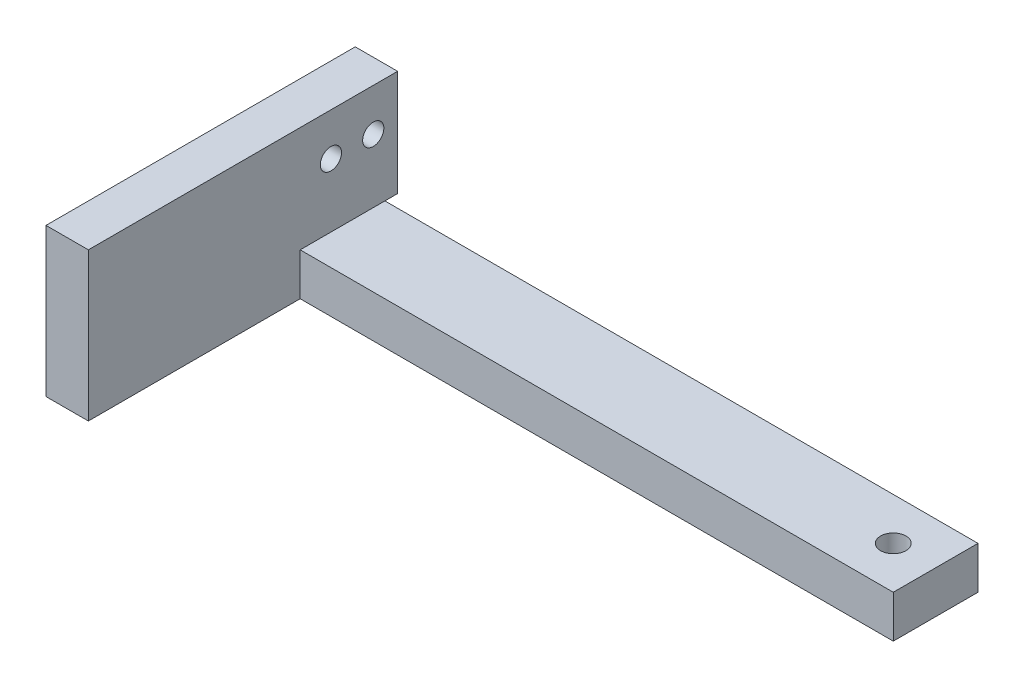
ISO-10303-21;
HEADER;
FILE_DESCRIPTION(('STEP AP214'),'2;1');
FILE_NAME('part.step','',(''),(''),'','','');
FILE_SCHEMA(('AUTOMOTIVE_DESIGN { 1 0 10303 214 1 1 1 1 }'));
ENDSEC;
DATA;
#1=APPLICATION_CONTEXT('core data for automotive mechanical design processes');
#2=APPLICATION_PROTOCOL_DEFINITION('international standard','automotive_design',2000,#1);
#3=PRODUCT_CONTEXT('',#1,'mechanical');
#4=PRODUCT('Part','Part','',(#3));
#5=PRODUCT_RELATED_PRODUCT_CATEGORY('part','',(#4));
#6=PRODUCT_DEFINITION_FORMATION('','',#4);
#7=PRODUCT_DEFINITION_CONTEXT('part definition',#1,'design');
#8=PRODUCT_DEFINITION('design','',#6,#7);
#9=PRODUCT_DEFINITION_SHAPE('','',#8);
#10=(LENGTH_UNIT() NAMED_UNIT(*) SI_UNIT(.MILLI.,.METRE.));
#11=(NAMED_UNIT(*) PLANE_ANGLE_UNIT() SI_UNIT($,.RADIAN.));
#12=(NAMED_UNIT(*) SI_UNIT($,.STERADIAN.) SOLID_ANGLE_UNIT());
#13=UNCERTAINTY_MEASURE_WITH_UNIT(LENGTH_MEASURE(1.E-05),#10,'distance_accuracy_value','');
#14=(GEOMETRIC_REPRESENTATION_CONTEXT(3) GLOBAL_UNCERTAINTY_ASSIGNED_CONTEXT((#13)) GLOBAL_UNIT_ASSIGNED_CONTEXT((#10,
#11,#12)) REPRESENTATION_CONTEXT('',''));
#15=CARTESIAN_POINT('',(0.,0.,0.));
#16=DIRECTION('',(0.,0.,1.));
#17=DIRECTION('',(1.,0.,0.));
#18=AXIS2_PLACEMENT_3D('',#15,#16,#17);
#19=CARTESIAN_POINT('',(-2547.77070063694,10.,-431.167728237792));
#20=DIRECTION('',(0.,0.,-1.));
#21=DIRECTION('',(-1.,0.,0.));
#22=AXIS2_PLACEMENT_3D('',#19,#20,#21);
#23=PLANE('',#22);
#24=DIRECTION('',(0.,1.,0.));
#25=VECTOR('',#24,1.);
#26=CARTESIAN_POINT('',(-2537.77070063694,35.,-431.167728237793));
#27=LINE('',#26,#25);
#28=CARTESIAN_POINT('',(-2537.77070063694,0.,-431.167728237792));
#29=VERTEX_POINT('',#28);
#30=CARTESIAN_POINT('',(-2537.77070063694,10.,-431.167728237792));
#31=VERTEX_POINT('',#30);
#32=EDGE_CURVE('E50',#29,#31,#27,.T.);
#33=ORIENTED_EDGE('',*,*,#32,.F.);
#34=DIRECTION('',(1.,0.,0.));
#35=VECTOR('',#34,1.);
#36=CARTESIAN_POINT('',(-2547.77070063694,0.,-431.167728237792));
#37=LINE('',#36,#35);
#38=CARTESIAN_POINT('',(-2397.77070063694,0.,-431.167728237792));
#39=VERTEX_POINT('',#38);
#40=EDGE_CURVE('E171',#29,#39,#37,.T.);
#41=ORIENTED_EDGE('',*,*,#40,.T.);
#42=DIRECTION('',(0.,-1.,0.));
#43=VECTOR('',#42,1.);
#44=CARTESIAN_POINT('',(-2397.77070063694,10.,-431.167728237792));
#45=LINE('',#44,#43);
#46=CARTESIAN_POINT('',(-2397.77070063694,10.,-431.167728237792));
#47=VERTEX_POINT('',#46);
#48=EDGE_CURVE('E41',#47,#39,#45,.T.);
#49=ORIENTED_EDGE('',*,*,#48,.F.);
#50=DIRECTION('',(1.,0.,0.));
#51=VECTOR('',#50,1.);
#52=CARTESIAN_POINT('',(-2547.77070063694,10.,-431.167728237792));
#53=LINE('',#52,#51);
#54=EDGE_CURVE('E161',#31,#47,#53,.T.);
#55=ORIENTED_EDGE('',*,*,#54,.F.);
#56=EDGE_LOOP('',(#33,#41,#49,#55));
#57=FACE_BOUND('',#56,.T.);
#58=ADVANCED_FACE('F32',(#57),#23,.F.);
#59=CARTESIAN_POINT('',(0.,10.,0.));
#60=DIRECTION('',(0.,1.,0.));
#61=DIRECTION('',(0.,0.,1.));
#62=AXIS2_PLACEMENT_3D('',#59,#60,#61);
#63=PLANE('',#62);
#64=CARTESIAN_POINT('',(-2407.77070063694,10.,-441.167728237792));
#65=DIRECTION('',(0.,1.,0.));
#66=DIRECTION('',(0.,0.,1.));
#67=AXIS2_PLACEMENT_3D('',#64,#65,#66);
#68=CIRCLE('',#67,3.00000000000017);
#69=CARTESIAN_POINT('',(-2407.77070063694,10.,-438.167728237792));
#70=VERTEX_POINT('',#69);
#71=EDGE_CURVE('E153',#70,#70,#68,.T.);
#72=ORIENTED_EDGE('',*,*,#71,.F.);
#73=EDGE_LOOP('',(#72));
#74=FACE_BOUND('',#73,.T.);
#75=DIRECTION('',(-1.,0.,0.));
#76=VECTOR('',#75,1.);
#77=CARTESIAN_POINT('',(-2547.77070063694,10.,-451.167728237792));
#78=LINE('',#77,#76);
#79=CARTESIAN_POINT('',(-2397.77070063694,10.,-451.167728237792));
#80=VERTEX_POINT('',#79);
#81=CARTESIAN_POINT('',(-2537.77070063694,10.,-451.167728237792));
#82=VERTEX_POINT('',#81);
#83=EDGE_CURVE('E167',#80,#82,#78,.T.);
#84=ORIENTED_EDGE('',*,*,#83,.T.);
#85=DIRECTION('',(0.,0.,1.));
#86=VECTOR('',#85,1.);
#87=CARTESIAN_POINT('',(-2537.77070063694,10.,-454.167728237792));
#88=LINE('',#87,#86);
#89=EDGE_CURVE('E11',#82,#31,#88,.T.);
#90=ORIENTED_EDGE('',*,*,#89,.T.);
#91=ORIENTED_EDGE('',*,*,#54,.T.);
#92=DIRECTION('',(0.,0.,-1.));
#93=VECTOR('',#92,1.);
#94=CARTESIAN_POINT('',(-2397.77070063694,10.,-451.167728237792));
#95=LINE('',#94,#93);
#96=EDGE_CURVE('E163',#47,#80,#95,.T.);
#97=ORIENTED_EDGE('',*,*,#96,.T.);
#98=EDGE_LOOP('',(#84,#90,#91,#97));
#99=FACE_BOUND('',#98,.T.);
#100=ADVANCED_FACE('F202',(#74,#99),#63,.T.);
#101=CARTESIAN_POINT('',(-2547.77070063694,10.,-451.167728237792));
#102=DIRECTION('',(1.,0.,0.));
#103=DIRECTION('',(0.,0.,-1.));
#104=AXIS2_PLACEMENT_3D('',#101,#102,#103);
#105=PLANE('',#104);
#106=CARTESIAN_POINT('',(-2547.77070063694,25.,-448.417728237792));
#107=DIRECTION('',(-1.,0.,0.));
#108=DIRECTION('',(0.,0.,1.));
#109=AXIS2_PLACEMENT_3D('',#106,#107,#108);
#110=CIRCLE('',#109,2.50000000000002);
#111=CARTESIAN_POINT('',(-2547.77070063694,25.,-445.917728237792));
#112=VERTEX_POINT('',#111);
#113=EDGE_CURVE('E136',#112,#112,#110,.T.);
#114=ORIENTED_EDGE('',*,*,#113,.F.);
#115=EDGE_LOOP('',(#114));
#116=FACE_BOUND('',#115,.T.);
#117=CARTESIAN_POINT('',(-2547.77070063694,25.,-438.417728237792));
#118=DIRECTION('',(-1.,0.,0.));
#119=DIRECTION('',(0.,0.,1.));
#120=AXIS2_PLACEMENT_3D('',#117,#118,#119);
#121=CIRCLE('',#120,2.50000000000002);
#122=CARTESIAN_POINT('',(-2547.77070063694,25.,-435.917728237792));
#123=VERTEX_POINT('',#122);
#124=EDGE_CURVE('E135',#123,#123,#121,.T.);
#125=ORIENTED_EDGE('',*,*,#124,.F.);
#126=EDGE_LOOP('',(#125));
#127=FACE_BOUND('',#126,.T.);
#128=DIRECTION('',(0.,0.,1.));
#129=VECTOR('',#128,1.);
#130=CARTESIAN_POINT('',(-2547.77070063694,0.,-451.167728237792));
#131=LINE('',#130,#129);
#132=CARTESIAN_POINT('',(-2547.77070063694,0.,-451.167728237792));
#133=VERTEX_POINT('',#132);
#134=CARTESIAN_POINT('',(-2547.77070063694,0.,-381.167728237793));
#135=VERTEX_POINT('',#134);
#136=EDGE_CURVE('E158',#133,#135,#131,.T.);
#137=ORIENTED_EDGE('',*,*,#136,.T.);
#138=DIRECTION('',(0.,-1.,0.));
#139=VECTOR('',#138,1.);
#140=CARTESIAN_POINT('',(-2547.77070063694,35.,-381.167728237793));
#141=LINE('',#140,#139);
#142=CARTESIAN_POINT('',(-2547.77070063694,35.,-381.167728237793));
#143=VERTEX_POINT('',#142);
#144=EDGE_CURVE('E122',#143,#135,#141,.T.);
#145=ORIENTED_EDGE('',*,*,#144,.F.);
#146=DIRECTION('',(0.,0.,-1.));
#147=VECTOR('',#146,1.);
#148=CARTESIAN_POINT('',(-2547.77070063694,35.,-454.167728237792));
#149=LINE('',#148,#147);
#150=CARTESIAN_POINT('',(-2547.77070063694,35.,-454.167728237792));
#151=VERTEX_POINT('',#150);
#152=EDGE_CURVE('E118',#143,#151,#149,.T.);
#153=ORIENTED_EDGE('',*,*,#152,.T.);
#154=DIRECTION('',(0.,-1.,0.));
#155=VECTOR('',#154,1.);
#156=CARTESIAN_POINT('',(-2547.77070063694,35.,-454.167728237792));
#157=LINE('',#156,#155);
#158=CARTESIAN_POINT('',(-2547.77070063694,10.,-454.167728237792));
#159=VERTEX_POINT('',#158);
#160=EDGE_CURVE('E146',#151,#159,#157,.T.);
#161=ORIENTED_EDGE('',*,*,#160,.T.);
#162=DIRECTION('',(0.,0.,1.));
#163=VECTOR('',#162,1.);
#164=CARTESIAN_POINT('',(-2547.77070063694,10.,-454.167728237792));
#165=LINE('',#164,#163);
#166=CARTESIAN_POINT('',(-2547.77070063694,10.,-451.167728237792));
#167=VERTEX_POINT('',#166);
#168=EDGE_CURVE('E112',#159,#167,#165,.T.);
#169=ORIENTED_EDGE('',*,*,#168,.T.);
#170=DIRECTION('',(0.,-1.,0.));
#171=VECTOR('',#170,1.);
#172=CARTESIAN_POINT('',(-2547.77070063694,10.,-451.167728237792));
#173=LINE('',#172,#171);
#174=EDGE_CURVE('E169',#167,#133,#173,.T.);
#175=ORIENTED_EDGE('',*,*,#174,.T.);
#176=EDGE_LOOP('',(#137,#145,#153,#161,#169,#175));
#177=FACE_BOUND('',#176,.T.);
#178=ADVANCED_FACE('F34',(#116,#127,#177),#105,.F.);
#179=CARTESIAN_POINT('',(-2397.77070063694,10.,-451.167728237792));
#180=DIRECTION('',(-1.,0.,0.));
#181=DIRECTION('',(0.,0.,1.));
#182=AXIS2_PLACEMENT_3D('',#179,#180,#181);
#183=PLANE('',#182);
#184=DIRECTION('',(0.,0.,-1.));
#185=VECTOR('',#184,1.);
#186=CARTESIAN_POINT('',(-2397.77070063694,0.,-451.167728237792));
#187=LINE('',#186,#185);
#188=CARTESIAN_POINT('',(-2397.77070063694,0.,-451.167728237792));
#189=VERTEX_POINT('',#188);
#190=EDGE_CURVE('E173',#39,#189,#187,.T.);
#191=ORIENTED_EDGE('',*,*,#190,.T.);
#192=DIRECTION('',(0.,-1.,0.));
#193=VECTOR('',#192,1.);
#194=CARTESIAN_POINT('',(-2397.77070063694,10.,-451.167728237792));
#195=LINE('',#194,#193);
#196=EDGE_CURVE('E178',#80,#189,#195,.T.);
#197=ORIENTED_EDGE('',*,*,#196,.F.);
#198=ORIENTED_EDGE('',*,*,#96,.F.);
#199=ORIENTED_EDGE('',*,*,#48,.T.);
#200=EDGE_LOOP('',(#191,#197,#198,#199));
#201=FACE_BOUND('',#200,.T.);
#202=ADVANCED_FACE('F209',(#201),#183,.F.);
#203=CARTESIAN_POINT('',(-2547.77070063694,10.,-451.167728237792));
#204=DIRECTION('',(0.,0.,1.));
#205=DIRECTION('',(1.,0.,0.));
#206=AXIS2_PLACEMENT_3D('',#203,#204,#205);
#207=PLANE('',#206);
#208=DIRECTION('',(-1.,0.,0.));
#209=VECTOR('',#208,1.);
#210=CARTESIAN_POINT('',(-2547.77070063694,0.,-451.167728237792));
#211=LINE('',#210,#209);
#212=EDGE_CURVE('E164',#189,#133,#211,.T.);
#213=ORIENTED_EDGE('',*,*,#212,.T.);
#214=ORIENTED_EDGE('',*,*,#174,.F.);
#215=EDGE_CURVE('E166',#82,#167,#78,.T.);
#216=ORIENTED_EDGE('',*,*,#215,.F.);
#217=ORIENTED_EDGE('',*,*,#83,.F.);
#218=ORIENTED_EDGE('',*,*,#196,.T.);
#219=EDGE_LOOP('',(#213,#214,#216,#217,#218));
#220=FACE_BOUND('',#219,.T.);
#221=ADVANCED_FACE('F212',(#220),#207,.F.);
#222=CARTESIAN_POINT('',(0.,0.,0.));
#223=DIRECTION('',(0.,1.,0.));
#224=DIRECTION('',(0.,0.,1.));
#225=AXIS2_PLACEMENT_3D('',#222,#223,#224);
#226=PLANE('',#225);
#227=CARTESIAN_POINT('',(-2407.77070063694,0.,-441.167728237792));
#228=DIRECTION('',(0.,1.,0.));
#229=DIRECTION('',(0.,0.,1.));
#230=AXIS2_PLACEMENT_3D('',#227,#228,#229);
#231=CIRCLE('',#230,3.00000000000017);
#232=CARTESIAN_POINT('',(-2407.77070063694,0.,-438.167728237792));
#233=VERTEX_POINT('',#232);
#234=EDGE_CURVE('E155',#233,#233,#231,.T.);
#235=ORIENTED_EDGE('',*,*,#234,.T.);
#236=EDGE_LOOP('',(#235));
#237=FACE_BOUND('',#236,.T.);
#238=ORIENTED_EDGE('',*,*,#136,.F.);
#239=ORIENTED_EDGE('',*,*,#212,.F.);
#240=ORIENTED_EDGE('',*,*,#190,.F.);
#241=ORIENTED_EDGE('',*,*,#40,.F.);
#242=DIRECTION('',(0.,0.,-1.));
#243=VECTOR('',#242,1.);
#244=CARTESIAN_POINT('',(-2537.77070063694,0.,-381.167728237793));
#245=LINE('',#244,#243);
#246=CARTESIAN_POINT('',(-2537.77070063694,0.,-381.167728237793));
#247=VERTEX_POINT('',#246);
#248=EDGE_CURVE('E132',#247,#29,#245,.T.);
#249=ORIENTED_EDGE('',*,*,#248,.F.);
#250=DIRECTION('',(1.,0.,0.));
#251=VECTOR('',#250,1.);
#252=CARTESIAN_POINT('',(-2547.77070063694,0.,-381.167728237793));
#253=LINE('',#252,#251);
#254=EDGE_CURVE('E126',#135,#247,#253,.T.);
#255=ORIENTED_EDGE('',*,*,#254,.F.);
#256=EDGE_LOOP('',(#238,#239,#240,#241,#249,#255));
#257=FACE_BOUND('',#256,.T.);
#258=ADVANCED_FACE('F216',(#237,#257),#226,.F.);
#259=CARTESIAN_POINT('',(-2407.77070063694,0.,-441.167728237792));
#260=DIRECTION('',(0.,1.,0.));
#261=DIRECTION('',(0.,0.,1.));
#262=AXIS2_PLACEMENT_3D('',#259,#260,#261);
#263=CYLINDRICAL_SURFACE('',#262,3.00000000000017);
#264=ORIENTED_EDGE('',*,*,#234,.F.);
#265=EDGE_LOOP('',(#264));
#266=FACE_BOUND('',#265,.T.);
#267=ORIENTED_EDGE('',*,*,#71,.T.);
#268=EDGE_LOOP('',(#267));
#269=FACE_BOUND('',#268,.T.);
#270=ADVANCED_FACE('F219',(#266,#269),#263,.F.);
#271=CARTESIAN_POINT('',(-2537.77070063694,10.,-454.167728237792));
#272=DIRECTION('',(0.,-1.,0.));
#273=DIRECTION('',(0.,0.,-1.));
#274=AXIS2_PLACEMENT_3D('',#271,#272,#273);
#275=PLANE('',#274);
#276=CARTESIAN_POINT('',(-2537.77070063694,10.,-454.167728237792));
#277=VERTEX_POINT('',#276);
#278=EDGE_CURVE('E43',#277,#82,#88,.T.);
#279=ORIENTED_EDGE('',*,*,#278,.T.);
#280=ORIENTED_EDGE('',*,*,#215,.T.);
#281=ORIENTED_EDGE('',*,*,#168,.F.);
#282=DIRECTION('',(-1.,0.,0.));
#283=VECTOR('',#282,1.);
#284=CARTESIAN_POINT('',(-2537.77070063694,10.,-454.167728237792));
#285=LINE('',#284,#283);
#286=EDGE_CURVE('E151',#277,#159,#285,.T.);
#287=ORIENTED_EDGE('',*,*,#286,.F.);
#288=EDGE_LOOP('',(#279,#280,#281,#287));
#289=FACE_BOUND('',#288,.T.);
#290=ADVANCED_FACE('F224',(#289),#275,.T.);
#291=CARTESIAN_POINT('',(-2537.77070063694,35.,-454.167728237792));
#292=DIRECTION('',(0.,0.,-1.));
#293=DIRECTION('',(-1.,0.,0.));
#294=AXIS2_PLACEMENT_3D('',#291,#292,#293);
#295=PLANE('',#294);
#296=ORIENTED_EDGE('',*,*,#160,.F.);
#297=DIRECTION('',(-1.,0.,0.));
#298=VECTOR('',#297,1.);
#299=CARTESIAN_POINT('',(-2537.77070063694,35.,-454.167728237792));
#300=LINE('',#299,#298);
#301=CARTESIAN_POINT('',(-2537.77070063694,35.,-454.167728237792));
#302=VERTEX_POINT('',#301);
#303=EDGE_CURVE('E144',#302,#151,#300,.T.);
#304=ORIENTED_EDGE('',*,*,#303,.F.);
#305=DIRECTION('',(0.,-1.,0.));
#306=VECTOR('',#305,1.);
#307=CARTESIAN_POINT('',(-2537.77070063694,35.,-454.167728237792));
#308=LINE('',#307,#306);
#309=EDGE_CURVE('E110',#302,#277,#308,.T.);
#310=ORIENTED_EDGE('',*,*,#309,.T.);
#311=ORIENTED_EDGE('',*,*,#286,.T.);
#312=EDGE_LOOP('',(#296,#304,#310,#311));
#313=FACE_BOUND('',#312,.T.);
#314=ADVANCED_FACE('F228',(#313),#295,.T.);
#315=CARTESIAN_POINT('',(-2537.77070063694,35.,-454.167728237792));
#316=DIRECTION('',(0.,1.,0.));
#317=DIRECTION('',(0.,0.,1.));
#318=AXIS2_PLACEMENT_3D('',#315,#316,#317);
#319=PLANE('',#318);
#320=ORIENTED_EDGE('',*,*,#152,.F.);
#321=DIRECTION('',(-1.,0.,0.));
#322=VECTOR('',#321,1.);
#323=CARTESIAN_POINT('',(-2547.77070063694,35.,-381.167728237793));
#324=LINE('',#323,#322);
#325=CARTESIAN_POINT('',(-2537.77070063694,35.,-381.167728237793));
#326=VERTEX_POINT('',#325);
#327=EDGE_CURVE('E115',#326,#143,#324,.T.);
#328=ORIENTED_EDGE('',*,*,#327,.F.);
#329=DIRECTION('',(0.,0.,-1.));
#330=VECTOR('',#329,1.);
#331=CARTESIAN_POINT('',(-2537.77070063694,35.,-454.167728237792));
#332=LINE('',#331,#330);
#333=EDGE_CURVE('E102',#326,#302,#332,.T.);
#334=ORIENTED_EDGE('',*,*,#333,.T.);
#335=ORIENTED_EDGE('',*,*,#303,.T.);
#336=EDGE_LOOP('',(#320,#328,#334,#335));
#337=FACE_BOUND('',#336,.T.);
#338=ADVANCED_FACE('F116',(#337),#319,.T.);
#339=CARTESIAN_POINT('',(-2537.77070063694,0.,0.));
#340=DIRECTION('',(-1.,0.,0.));
#341=DIRECTION('',(0.,0.,1.));
#342=AXIS2_PLACEMENT_3D('',#339,#340,#341);
#343=PLANE('',#342);
#344=CARTESIAN_POINT('',(-2537.77070063694,25.,-448.417728237792));
#345=DIRECTION('',(-1.,0.,0.));
#346=DIRECTION('',(0.,0.,1.));
#347=AXIS2_PLACEMENT_3D('',#344,#345,#346);
#348=CIRCLE('',#347,2.50000000000002);
#349=CARTESIAN_POINT('',(-2537.77070063694,25.,-445.917728237792));
#350=VERTEX_POINT('',#349);
#351=EDGE_CURVE('E36',#350,#350,#348,.T.);
#352=ORIENTED_EDGE('',*,*,#351,.T.);
#353=EDGE_LOOP('',(#352));
#354=FACE_BOUND('',#353,.T.);
#355=CARTESIAN_POINT('',(-2537.77070063694,25.,-438.417728237792));
#356=DIRECTION('',(-1.,0.,0.));
#357=DIRECTION('',(0.,0.,1.));
#358=AXIS2_PLACEMENT_3D('',#355,#356,#357);
#359=CIRCLE('',#358,2.50000000000002);
#360=CARTESIAN_POINT('',(-2537.77070063694,25.,-435.917728237792));
#361=VERTEX_POINT('',#360);
#362=EDGE_CURVE('E139',#361,#361,#359,.T.);
#363=ORIENTED_EDGE('',*,*,#362,.T.);
#364=EDGE_LOOP('',(#363));
#365=FACE_BOUND('',#364,.T.);
#366=ORIENTED_EDGE('',*,*,#333,.F.);
#367=DIRECTION('',(0.,1.,0.));
#368=VECTOR('',#367,1.);
#369=CARTESIAN_POINT('',(-2537.77070063694,35.,-381.167728237793));
#370=LINE('',#369,#368);
#371=EDGE_CURVE('E107',#247,#326,#370,.T.);
#372=ORIENTED_EDGE('',*,*,#371,.F.);
#373=ORIENTED_EDGE('',*,*,#248,.T.);
#374=ORIENTED_EDGE('',*,*,#32,.T.);
#375=ORIENTED_EDGE('',*,*,#89,.F.);
#376=ORIENTED_EDGE('',*,*,#278,.F.);
#377=ORIENTED_EDGE('',*,*,#309,.F.);
#378=EDGE_LOOP('',(#366,#372,#373,#374,#375,#376,#377));
#379=FACE_BOUND('',#378,.T.);
#380=ADVANCED_FACE('F104',(#354,#365,#379),#343,.F.);
#381=CARTESIAN_POINT('',(-2397.77070063694,25.,-438.417728237792));
#382=DIRECTION('',(-1.,0.,0.));
#383=DIRECTION('',(0.,0.,1.));
#384=AXIS2_PLACEMENT_3D('',#381,#382,#383);
#385=CYLINDRICAL_SURFACE('',#384,2.50000000000002);
#386=ORIENTED_EDGE('',*,*,#124,.T.);
#387=EDGE_LOOP('',(#386));
#388=FACE_BOUND('',#387,.T.);
#389=ORIENTED_EDGE('',*,*,#362,.F.);
#390=EDGE_LOOP('',(#389));
#391=FACE_BOUND('',#390,.T.);
#392=ADVANCED_FACE('F191',(#388,#391),#385,.F.);
#393=CARTESIAN_POINT('',(-2397.77070063694,25.,-448.417728237792));
#394=DIRECTION('',(-1.,0.,0.));
#395=DIRECTION('',(0.,0.,1.));
#396=AXIS2_PLACEMENT_3D('',#393,#394,#395);
#397=CYLINDRICAL_SURFACE('',#396,2.50000000000002);
#398=ORIENTED_EDGE('',*,*,#113,.T.);
#399=EDGE_LOOP('',(#398));
#400=FACE_BOUND('',#399,.T.);
#401=ORIENTED_EDGE('',*,*,#351,.F.);
#402=EDGE_LOOP('',(#401));
#403=FACE_BOUND('',#402,.T.);
#404=ADVANCED_FACE('F189',(#400,#403),#397,.F.);
#405=CARTESIAN_POINT('',(0.,0.,-381.167728237793));
#406=DIRECTION('',(0.,0.,1.));
#407=DIRECTION('',(1.,0.,0.));
#408=AXIS2_PLACEMENT_3D('',#405,#406,#407);
#409=PLANE('',#408);
#410=ORIENTED_EDGE('',*,*,#371,.T.);
#411=ORIENTED_EDGE('',*,*,#327,.T.);
#412=ORIENTED_EDGE('',*,*,#144,.T.);
#413=ORIENTED_EDGE('',*,*,#254,.T.);
#414=EDGE_LOOP('',(#410,#411,#412,#413));
#415=FACE_BOUND('',#414,.T.);
#416=ADVANCED_FACE('F124',(#415),#409,.T.);
#417=CLOSED_SHELL('',(#58,#100,#178,#202,#221,#258,#270,#290,#314,#338,#380,#392,#404,#416));
#418=MANIFOLD_SOLID_BREP('B2',#417);
#419=ADVANCED_BREP_SHAPE_REPRESENTATION('',(#18,#418),#14);
#420=SHAPE_DEFINITION_REPRESENTATION(#9,#419);
ENDSEC;
END-ISO-10303-21;
